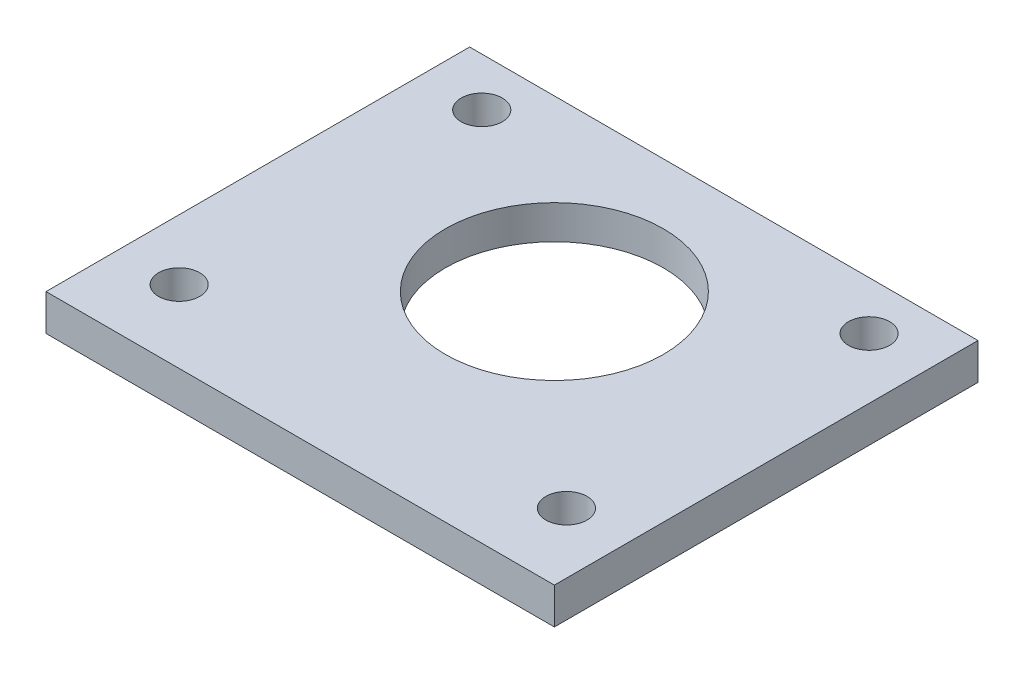
ISO-10303-21;
HEADER;
FILE_DESCRIPTION(('STEP AP214'),'2;1');
FILE_NAME('part.step','',(''),(''),'','','');
FILE_SCHEMA(('AUTOMOTIVE_DESIGN { 1 0 10303 214 1 1 1 1 }'));
ENDSEC;
DATA;
#1=APPLICATION_CONTEXT('core data for automotive mechanical design processes');
#2=APPLICATION_PROTOCOL_DEFINITION('international standard','automotive_design',2000,#1);
#3=PRODUCT_CONTEXT('',#1,'mechanical');
#4=PRODUCT('Part','Part','',(#3));
#5=PRODUCT_RELATED_PRODUCT_CATEGORY('part','',(#4));
#6=PRODUCT_DEFINITION_FORMATION('','',#4);
#7=PRODUCT_DEFINITION_CONTEXT('part definition',#1,'design');
#8=PRODUCT_DEFINITION('design','',#6,#7);
#9=PRODUCT_DEFINITION_SHAPE('','',#8);
#10=(LENGTH_UNIT() NAMED_UNIT(*) SI_UNIT(.MILLI.,.METRE.));
#11=(NAMED_UNIT(*) PLANE_ANGLE_UNIT() SI_UNIT($,.RADIAN.));
#12=(NAMED_UNIT(*) SI_UNIT($,.STERADIAN.) SOLID_ANGLE_UNIT());
#13=UNCERTAINTY_MEASURE_WITH_UNIT(LENGTH_MEASURE(1.E-05),#10,'distance_accuracy_value','');
#14=(GEOMETRIC_REPRESENTATION_CONTEXT(3) GLOBAL_UNCERTAINTY_ASSIGNED_CONTEXT((#13)) GLOBAL_UNIT_ASSIGNED_CONTEXT((#10,
#11,#12)) REPRESENTATION_CONTEXT('',''));
#15=CARTESIAN_POINT('',(0.,0.,0.));
#16=DIRECTION('',(0.,0.,1.));
#17=DIRECTION('',(1.,0.,0.));
#18=AXIS2_PLACEMENT_3D('',#15,#16,#17);
#19=CARTESIAN_POINT('',(21.,0.009599999999978,14.0096));
#20=DIRECTION('',(0.,1.,0.));
#21=DIRECTION('',(0.,0.,1.));
#22=AXIS2_PLACEMENT_3D('',#19,#20,#21);
#23=CYLINDRICAL_SURFACE('',#22,14.1);
#24=DIRECTION('',(0.,1.,0.));
#25=VECTOR('',#24,1.);
#26=CARTESIAN_POINT('',(19.323694538576,0.009599999999978,0.00960000000000023));
#27=LINE('',#26,#25);
#28=CARTESIAN_POINT('',(19.3236945385747,0.2096,0.00960000000015983));
#29=VERTEX_POINT('',#28);
#30=CARTESIAN_POINT('',(19.3236945385747,0.009599999999978,0.00960000000015983));
#31=VERTEX_POINT('',#30);
#32=EDGE_CURVE('E78',#29,#31,#27,.F.);
#33=ORIENTED_EDGE('',*,*,#32,.F.);
#34=CARTESIAN_POINT('',(21.,0.2096,14.0096));
#35=DIRECTION('',(0.,1.,0.));
#36=DIRECTION('',(0.,0.,1.));
#37=AXIS2_PLACEMENT_3D('',#34,#35,#36);
#38=CIRCLE('',#37,14.1);
#39=CARTESIAN_POINT('',(22.6763054614249,0.2096,0.00960000000009998));
#40=VERTEX_POINT('',#39);
#41=EDGE_CURVE('E19',#29,#40,#38,.T.);
#42=ORIENTED_EDGE('',*,*,#41,.T.);
#43=DIRECTION('',(0.,1.,0.));
#44=VECTOR('',#43,1.);
#45=CARTESIAN_POINT('',(22.676305461423,0.009599999999978,0.00959999999988054));
#46=LINE('',#45,#44);
#47=CARTESIAN_POINT('',(22.6763054614249,0.009599999999978,0.00960000000009998));
#48=VERTEX_POINT('',#47);
#49=EDGE_CURVE('E68',#48,#40,#46,.T.);
#50=ORIENTED_EDGE('',*,*,#49,.F.);
#51=CARTESIAN_POINT('',(21.,0.009599999999978,14.0096));
#52=DIRECTION('',(0.,1.,0.));
#53=DIRECTION('',(0.,0.,1.));
#54=AXIS2_PLACEMENT_3D('',#51,#52,#53);
#55=CIRCLE('',#54,14.1);
#56=EDGE_CURVE('E77',#48,#31,#55,.F.);
#57=ORIENTED_EDGE('',*,*,#56,.T.);
#58=EDGE_LOOP('',(#33,#42,#50,#57));
#59=FACE_BOUND('',#58,.T.);
#60=ADVANCED_FACE('F16',(#59),#23,.F.);
#61=CARTESIAN_POINT('',(21.,0.2096,14.0096));
#62=DIRECTION('',(0.,1.,0.));
#63=DIRECTION('',(0.,0.,1.));
#64=AXIS2_PLACEMENT_3D('',#61,#62,#63);
#65=PLANE('',#64);
#66=CARTESIAN_POINT('',(21.,0.2096,14.0096));
#67=DIRECTION('',(0.,1.,0.));
#68=DIRECTION('',(0.,0.,1.));
#69=AXIS2_PLACEMENT_3D('',#66,#67,#68);
#70=CIRCLE('',#69,9.);
#71=CARTESIAN_POINT('',(21.,0.2096,23.0096));
#72=VERTEX_POINT('',#71);
#73=EDGE_CURVE('E145',#72,#72,#70,.T.);
#74=ORIENTED_EDGE('',*,*,#73,.T.);
#75=EDGE_LOOP('',(#74));
#76=FACE_BOUND('',#75,.T.);
#77=ORIENTED_EDGE('',*,*,#41,.F.);
#78=DIRECTION('',(1.,0.,0.));
#79=VECTOR('',#78,1.);
#80=CARTESIAN_POINT('',(42.,0.2096,0.009600000000319));
#81=LINE('',#80,#79);
#82=EDGE_CURVE('E75',#29,#40,#81,.T.);
#83=ORIENTED_EDGE('',*,*,#82,.T.);
#84=EDGE_LOOP('',(#77,#83));
#85=FACE_BOUND('',#84,.T.);
#86=ADVANCED_FACE('F74',(#76,#85),#65,.F.);
#87=CARTESIAN_POINT('',(42.,0.009599999999864,0.009600000000319));
#88=DIRECTION('',(0.,1.,0.));
#89=DIRECTION('',(0.,0.,1.));
#90=AXIS2_PLACEMENT_3D('',#87,#88,#89);
#91=PLANE('',#90);
#92=CARTESIAN_POINT('',(5.,0.009599999999978,29.0096));
#93=DIRECTION('',(0.,1.,0.));
#94=DIRECTION('',(0.,0.,1.));
#95=AXIS2_PLACEMENT_3D('',#92,#93,#94);
#96=CIRCLE('',#95,1.7);
#97=CARTESIAN_POINT('',(5.,0.009599999999978,30.7096));
#98=VERTEX_POINT('',#97);
#99=EDGE_CURVE('E135',#98,#98,#96,.T.);
#100=ORIENTED_EDGE('',*,*,#99,.T.);
#101=EDGE_LOOP('',(#100));
#102=FACE_BOUND('',#101,.T.);
#103=CARTESIAN_POINT('',(37.,0.009599999999978,29.0096));
#104=DIRECTION('',(0.,1.,0.));
#105=DIRECTION('',(0.,0.,1.));
#106=AXIS2_PLACEMENT_3D('',#103,#104,#105);
#107=CIRCLE('',#106,1.7);
#108=CARTESIAN_POINT('',(37.,0.009599999999978,30.7096));
#109=VERTEX_POINT('',#108);
#110=EDGE_CURVE('E139',#109,#109,#107,.T.);
#111=ORIENTED_EDGE('',*,*,#110,.T.);
#112=EDGE_LOOP('',(#111));
#113=FACE_BOUND('',#112,.T.);
#114=CARTESIAN_POINT('',(5.,0.009599999999978,4.0096));
#115=DIRECTION('',(0.,1.,0.));
#116=DIRECTION('',(0.,0.,1.));
#117=AXIS2_PLACEMENT_3D('',#114,#115,#116);
#118=CIRCLE('',#117,1.7);
#119=CARTESIAN_POINT('',(5.,0.009599999999978,5.7096));
#120=VERTEX_POINT('',#119);
#121=EDGE_CURVE('E142',#120,#120,#118,.T.);
#122=ORIENTED_EDGE('',*,*,#121,.T.);
#123=EDGE_LOOP('',(#122));
#124=FACE_BOUND('',#123,.T.);
#125=CARTESIAN_POINT('',(37.,0.009599999999978,4.0096));
#126=DIRECTION('',(0.,1.,0.));
#127=DIRECTION('',(0.,0.,1.));
#128=AXIS2_PLACEMENT_3D('',#125,#126,#127);
#129=CIRCLE('',#128,1.7);
#130=CARTESIAN_POINT('',(37.,0.009599999999978,5.7096));
#131=VERTEX_POINT('',#130);
#132=EDGE_CURVE('E148',#131,#131,#129,.T.);
#133=ORIENTED_EDGE('',*,*,#132,.T.);
#134=EDGE_LOOP('',(#133));
#135=FACE_BOUND('',#134,.T.);
#136=DIRECTION('',(1.,0.,0.));
#137=VECTOR('',#136,1.);
#138=CARTESIAN_POINT('',(42.,0.009599999999978,0.009600000000319));
#139=LINE('',#138,#137);
#140=CARTESIAN_POINT('',(0.,0.009599999999978,0.009600000000319));
#141=VERTEX_POINT('',#140);
#142=EDGE_CURVE('E84',#141,#31,#139,.T.);
#143=ORIENTED_EDGE('',*,*,#142,.T.);
#144=ORIENTED_EDGE('',*,*,#56,.F.);
#145=DIRECTION('',(1.,0.,0.));
#146=VECTOR('',#145,1.);
#147=CARTESIAN_POINT('',(42.,0.009599999999978,0.009600000000319));
#148=LINE('',#147,#146);
#149=CARTESIAN_POINT('',(42.,0.009599999999978,0.009600000000319));
#150=VERTEX_POINT('',#149);
#151=EDGE_CURVE('E102',#48,#150,#148,.T.);
#152=ORIENTED_EDGE('',*,*,#151,.T.);
#153=DIRECTION('',(0.,0.,1.));
#154=VECTOR('',#153,1.);
#155=CARTESIAN_POINT('',(42.,0.009599999999978,0.009600000000319));
#156=LINE('',#155,#154);
#157=CARTESIAN_POINT('',(42.,0.009599999999978,35.0096));
#158=VERTEX_POINT('',#157);
#159=EDGE_CURVE('E104',#150,#158,#156,.T.);
#160=ORIENTED_EDGE('',*,*,#159,.T.);
#161=DIRECTION('',(1.,0.,0.));
#162=VECTOR('',#161,1.);
#163=CARTESIAN_POINT('',(42.,0.009599999999978,35.0096));
#164=LINE('',#163,#162);
#165=CARTESIAN_POINT('',(0.,0.009599999999921,35.0096));
#166=VERTEX_POINT('',#165);
#167=EDGE_CURVE('E97',#166,#158,#164,.T.);
#168=ORIENTED_EDGE('',*,*,#167,.F.);
#169=DIRECTION('',(0.,0.,1.));
#170=VECTOR('',#169,1.);
#171=CARTESIAN_POINT('',(0.,0.009599999999978,0.009600000000319));
#172=LINE('',#171,#170);
#173=EDGE_CURVE('E87',#141,#166,#172,.T.);
#174=ORIENTED_EDGE('',*,*,#173,.F.);
#175=EDGE_LOOP('',(#143,#144,#152,#160,#168,#174));
#176=FACE_BOUND('',#175,.T.);
#177=ADVANCED_FACE('F174',(#102,#113,#124,#135,#176),#91,.F.);
#178=CARTESIAN_POINT('',(42.,0.009599999999864,0.009600000000319));
#179=DIRECTION('',(-1.,0.,0.));
#180=DIRECTION('',(0.,0.,1.));
#181=AXIS2_PLACEMENT_3D('',#178,#179,#180);
#182=PLANE('',#181);
#183=DIRECTION('',(0.,1.,0.));
#184=VECTOR('',#183,1.);
#185=CARTESIAN_POINT('',(42.,0.009599999999864,35.0096));
#186=LINE('',#185,#184);
#187=CARTESIAN_POINT('',(42.,3.0096,35.0096));
#188=VERTEX_POINT('',#187);
#189=EDGE_CURVE('E113',#158,#188,#186,.T.);
#190=ORIENTED_EDGE('',*,*,#189,.F.);
#191=ORIENTED_EDGE('',*,*,#159,.F.);
#192=DIRECTION('',(0.,1.,0.));
#193=VECTOR('',#192,1.);
#194=CARTESIAN_POINT('',(42.,0.009599999999864,0.009600000000319));
#195=LINE('',#194,#193);
#196=CARTESIAN_POINT('',(42.,3.0096,0.009600000000148));
#197=VERTEX_POINT('',#196);
#198=EDGE_CURVE('E89',#150,#197,#195,.T.);
#199=ORIENTED_EDGE('',*,*,#198,.T.);
#200=DIRECTION('',(0.,0.,1.));
#201=VECTOR('',#200,1.);
#202=CARTESIAN_POINT('',(42.,3.0096,0.009600000000319));
#203=LINE('',#202,#201);
#204=EDGE_CURVE('E138',#188,#197,#203,.F.);
#205=ORIENTED_EDGE('',*,*,#204,.F.);
#206=EDGE_LOOP('',(#190,#191,#199,#205));
#207=FACE_BOUND('',#206,.T.);
#208=ADVANCED_FACE('F168',(#207),#182,.F.);
#209=CARTESIAN_POINT('',(42.,0.009599999999864,0.009600000000319));
#210=DIRECTION('',(0.,0.,1.));
#211=DIRECTION('',(1.,0.,0.));
#212=AXIS2_PLACEMENT_3D('',#209,#210,#211);
#213=PLANE('',#212);
#214=ORIENTED_EDGE('',*,*,#82,.F.);
#215=ORIENTED_EDGE('',*,*,#32,.T.);
#216=ORIENTED_EDGE('',*,*,#142,.F.);
#217=DIRECTION('',(0.,1.,0.));
#218=VECTOR('',#217,1.);
#219=CARTESIAN_POINT('',(0.,0.009599999999864,0.009600000000091));
#220=LINE('',#219,#218);
#221=CARTESIAN_POINT('',(0.,3.0096,0.009600000000205));
#222=VERTEX_POINT('',#221);
#223=EDGE_CURVE('E83',#222,#141,#220,.F.);
#224=ORIENTED_EDGE('',*,*,#223,.F.);
#225=DIRECTION('',(1.,0.,0.));
#226=VECTOR('',#225,1.);
#227=CARTESIAN_POINT('',(42.,3.0096,0.009600000000091));
#228=LINE('',#227,#226);
#229=EDGE_CURVE('E164',#197,#222,#228,.F.);
#230=ORIENTED_EDGE('',*,*,#229,.F.);
#231=ORIENTED_EDGE('',*,*,#198,.F.);
#232=ORIENTED_EDGE('',*,*,#151,.F.);
#233=ORIENTED_EDGE('',*,*,#49,.T.);
#234=EDGE_LOOP('',(#214,#215,#216,#224,#230,#231,#232,#233));
#235=FACE_BOUND('',#234,.T.);
#236=ADVANCED_FACE('F82',(#235),#213,.F.);
#237=CARTESIAN_POINT('',(0.,0.009599999999864,0.009600000000319));
#238=DIRECTION('',(-1.,0.,0.));
#239=DIRECTION('',(0.,0.,1.));
#240=AXIS2_PLACEMENT_3D('',#237,#238,#239);
#241=PLANE('',#240);
#242=DIRECTION('',(0.,1.,0.));
#243=VECTOR('',#242,1.);
#244=CARTESIAN_POINT('',(0.,0.009599999999864,35.0096));
#245=LINE('',#244,#243);
#246=CARTESIAN_POINT('',(0.,3.0096,35.0096));
#247=VERTEX_POINT('',#246);
#248=EDGE_CURVE('E34',#247,#166,#245,.F.);
#249=ORIENTED_EDGE('',*,*,#248,.F.);
#250=DIRECTION('',(0.,0.,1.));
#251=VECTOR('',#250,1.);
#252=CARTESIAN_POINT('',(0.,3.0096,0.009600000000319));
#253=LINE('',#252,#251);
#254=EDGE_CURVE('E159',#222,#247,#253,.T.);
#255=ORIENTED_EDGE('',*,*,#254,.F.);
#256=ORIENTED_EDGE('',*,*,#223,.T.);
#257=ORIENTED_EDGE('',*,*,#173,.T.);
#258=EDGE_LOOP('',(#249,#255,#256,#257));
#259=FACE_BOUND('',#258,.T.);
#260=ADVANCED_FACE('F172',(#259),#241,.T.);
#261=CARTESIAN_POINT('',(42.,0.009599999999864,35.0096));
#262=DIRECTION('',(0.,0.,1.));
#263=DIRECTION('',(1.,0.,0.));
#264=AXIS2_PLACEMENT_3D('',#261,#262,#263);
#265=PLANE('',#264);
#266=DIRECTION('',(1.,0.,0.));
#267=VECTOR('',#266,1.);
#268=CARTESIAN_POINT('',(42.,3.0096,35.0096));
#269=LINE('',#268,#267);
#270=EDGE_CURVE('E134',#247,#188,#269,.T.);
#271=ORIENTED_EDGE('',*,*,#270,.F.);
#272=ORIENTED_EDGE('',*,*,#248,.T.);
#273=ORIENTED_EDGE('',*,*,#167,.T.);
#274=ORIENTED_EDGE('',*,*,#189,.T.);
#275=EDGE_LOOP('',(#271,#272,#273,#274));
#276=FACE_BOUND('',#275,.T.);
#277=ADVANCED_FACE('F153',(#276),#265,.T.);
#278=CARTESIAN_POINT('',(37.,0.009599999999864,4.0096));
#279=DIRECTION('',(0.,1.,0.));
#280=DIRECTION('',(0.,0.,1.));
#281=AXIS2_PLACEMENT_3D('',#278,#279,#280);
#282=CYLINDRICAL_SURFACE('',#281,1.7);
#283=ORIENTED_EDGE('',*,*,#132,.F.);
#284=EDGE_LOOP('',(#283));
#285=FACE_BOUND('',#284,.T.);
#286=CARTESIAN_POINT('',(37.,3.0096,4.0096));
#287=DIRECTION('',(0.,1.,0.));
#288=DIRECTION('',(0.,0.,1.));
#289=AXIS2_PLACEMENT_3D('',#286,#287,#288);
#290=CIRCLE('',#289,1.7);
#291=CARTESIAN_POINT('',(37.,3.0096,5.7096));
#292=VERTEX_POINT('',#291);
#293=EDGE_CURVE('E131',#292,#292,#290,.F.);
#294=ORIENTED_EDGE('',*,*,#293,.F.);
#295=EDGE_LOOP('',(#294));
#296=FACE_BOUND('',#295,.T.);
#297=ADVANCED_FACE('F208',(#285,#296),#282,.F.);
#298=CARTESIAN_POINT('',(21.,0.009599999999864,14.0096));
#299=DIRECTION('',(0.,1.,0.));
#300=DIRECTION('',(0.,0.,1.));
#301=AXIS2_PLACEMENT_3D('',#298,#299,#300);
#302=CYLINDRICAL_SURFACE('',#301,9.);
#303=CARTESIAN_POINT('',(21.,3.0096,14.0096));
#304=DIRECTION('',(0.,1.,0.));
#305=DIRECTION('',(0.,0.,1.));
#306=AXIS2_PLACEMENT_3D('',#303,#304,#305);
#307=CIRCLE('',#306,9.);
#308=CARTESIAN_POINT('',(21.,3.0096,23.0096));
#309=VERTEX_POINT('',#308);
#310=EDGE_CURVE('E128',#309,#309,#307,.F.);
#311=ORIENTED_EDGE('',*,*,#310,.F.);
#312=EDGE_LOOP('',(#311));
#313=FACE_BOUND('',#312,.T.);
#314=ORIENTED_EDGE('',*,*,#73,.F.);
#315=EDGE_LOOP('',(#314));
#316=FACE_BOUND('',#315,.T.);
#317=ADVANCED_FACE('F204',(#313,#316),#302,.F.);
#318=CARTESIAN_POINT('',(5.,0.009599999999864,4.0096));
#319=DIRECTION('',(0.,1.,0.));
#320=DIRECTION('',(0.,0.,1.));
#321=AXIS2_PLACEMENT_3D('',#318,#319,#320);
#322=CYLINDRICAL_SURFACE('',#321,1.7);
#323=ORIENTED_EDGE('',*,*,#121,.F.);
#324=EDGE_LOOP('',(#323));
#325=FACE_BOUND('',#324,.T.);
#326=CARTESIAN_POINT('',(5.,3.0096,4.0096));
#327=DIRECTION('',(0.,1.,0.));
#328=DIRECTION('',(0.,0.,1.));
#329=AXIS2_PLACEMENT_3D('',#326,#327,#328);
#330=CIRCLE('',#329,1.7);
#331=CARTESIAN_POINT('',(5.,3.0096,5.7096));
#332=VERTEX_POINT('',#331);
#333=EDGE_CURVE('E125',#332,#332,#330,.F.);
#334=ORIENTED_EDGE('',*,*,#333,.F.);
#335=EDGE_LOOP('',(#334));
#336=FACE_BOUND('',#335,.T.);
#337=ADVANCED_FACE('F200',(#325,#336),#322,.F.);
#338=CARTESIAN_POINT('',(37.,0.009599999999864,29.0096));
#339=DIRECTION('',(0.,1.,0.));
#340=DIRECTION('',(0.,0.,1.));
#341=AXIS2_PLACEMENT_3D('',#338,#339,#340);
#342=CYLINDRICAL_SURFACE('',#341,1.7);
#343=ORIENTED_EDGE('',*,*,#110,.F.);
#344=EDGE_LOOP('',(#343));
#345=FACE_BOUND('',#344,.T.);
#346=CARTESIAN_POINT('',(37.,3.0096,29.0096));
#347=DIRECTION('',(0.,1.,0.));
#348=DIRECTION('',(0.,0.,1.));
#349=AXIS2_PLACEMENT_3D('',#346,#347,#348);
#350=CIRCLE('',#349,1.7);
#351=CARTESIAN_POINT('',(37.,3.0096,30.7096));
#352=VERTEX_POINT('',#351);
#353=EDGE_CURVE('E25',#352,#352,#350,.F.);
#354=ORIENTED_EDGE('',*,*,#353,.F.);
#355=EDGE_LOOP('',(#354));
#356=FACE_BOUND('',#355,.T.);
#357=ADVANCED_FACE('F193',(#345,#356),#342,.F.);
#358=CARTESIAN_POINT('',(5.,0.009599999999864,29.0096));
#359=DIRECTION('',(0.,1.,0.));
#360=DIRECTION('',(0.,0.,1.));
#361=AXIS2_PLACEMENT_3D('',#358,#359,#360);
#362=CYLINDRICAL_SURFACE('',#361,1.7);
#363=ORIENTED_EDGE('',*,*,#99,.F.);
#364=EDGE_LOOP('',(#363));
#365=FACE_BOUND('',#364,.T.);
#366=CARTESIAN_POINT('',(5.,3.0096,29.0096));
#367=DIRECTION('',(0.,1.,0.));
#368=DIRECTION('',(0.,0.,1.));
#369=AXIS2_PLACEMENT_3D('',#366,#367,#368);
#370=CIRCLE('',#369,1.7);
#371=CARTESIAN_POINT('',(5.,3.0096,30.7096));
#372=VERTEX_POINT('',#371);
#373=EDGE_CURVE('E11',#372,#372,#370,.F.);
#374=ORIENTED_EDGE('',*,*,#373,.F.);
#375=EDGE_LOOP('',(#374));
#376=FACE_BOUND('',#375,.T.);
#377=ADVANCED_FACE('F187',(#365,#376),#362,.F.);
#378=CARTESIAN_POINT('',(42.,3.0096,0.009600000000319));
#379=DIRECTION('',(0.,1.,0.));
#380=DIRECTION('',(0.,0.,1.));
#381=AXIS2_PLACEMENT_3D('',#378,#379,#380);
#382=PLANE('',#381);
#383=ORIENTED_EDGE('',*,*,#373,.T.);
#384=EDGE_LOOP('',(#383));
#385=FACE_BOUND('',#384,.T.);
#386=ORIENTED_EDGE('',*,*,#353,.T.);
#387=EDGE_LOOP('',(#386));
#388=FACE_BOUND('',#387,.T.);
#389=ORIENTED_EDGE('',*,*,#333,.T.);
#390=EDGE_LOOP('',(#389));
#391=FACE_BOUND('',#390,.T.);
#392=ORIENTED_EDGE('',*,*,#310,.T.);
#393=EDGE_LOOP('',(#392));
#394=FACE_BOUND('',#393,.T.);
#395=ORIENTED_EDGE('',*,*,#293,.T.);
#396=EDGE_LOOP('',(#395));
#397=FACE_BOUND('',#396,.T.);
#398=ORIENTED_EDGE('',*,*,#254,.T.);
#399=ORIENTED_EDGE('',*,*,#270,.T.);
#400=ORIENTED_EDGE('',*,*,#204,.T.);
#401=ORIENTED_EDGE('',*,*,#229,.T.);
#402=EDGE_LOOP('',(#398,#399,#400,#401));
#403=FACE_BOUND('',#402,.T.);
#404=ADVANCED_FACE('F162',(#385,#388,#391,#394,#397,#403),#382,.T.);
#405=CLOSED_SHELL('',(#60,#86,#177,#208,#236,#260,#277,#297,#317,#337,#357,#377,#404));
#406=MANIFOLD_SOLID_BREP('B1',#405);
#407=ADVANCED_BREP_SHAPE_REPRESENTATION('',(#18,#406),#14);
#408=SHAPE_DEFINITION_REPRESENTATION(#9,#407);
ENDSEC;
END-ISO-10303-21;
